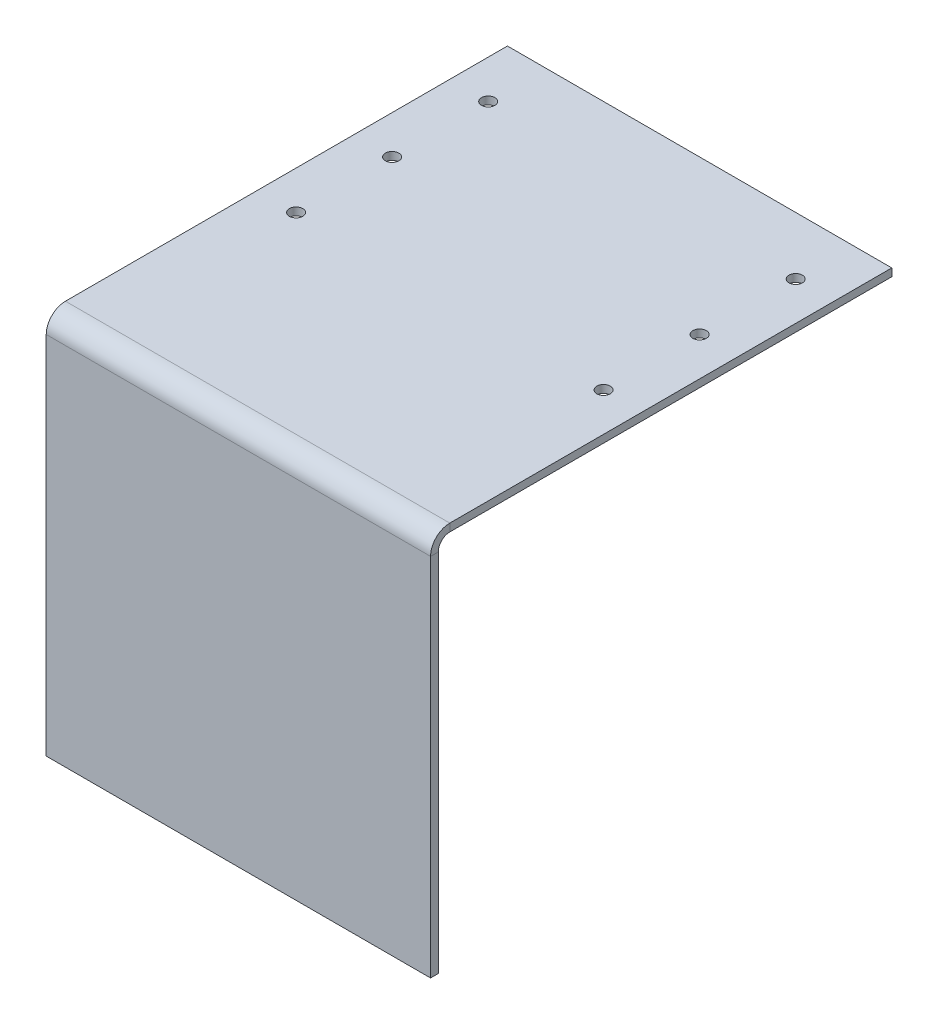
ISO-10303-21;
HEADER;
FILE_DESCRIPTION(('STEP AP214'),'2;1');
FILE_NAME('part.step','',(''),(''),'','','');
FILE_SCHEMA(('AUTOMOTIVE_DESIGN { 1 0 10303 214 1 1 1 1 }'));
ENDSEC;
DATA;
#1=APPLICATION_CONTEXT('core data for automotive mechanical design processes');
#2=APPLICATION_PROTOCOL_DEFINITION('international standard','automotive_design',2000,#1);
#3=PRODUCT_CONTEXT('',#1,'mechanical');
#4=PRODUCT('Part','Part','',(#3));
#5=PRODUCT_RELATED_PRODUCT_CATEGORY('part','',(#4));
#6=PRODUCT_DEFINITION_FORMATION('','',#4);
#7=PRODUCT_DEFINITION_CONTEXT('part definition',#1,'design');
#8=PRODUCT_DEFINITION('design','',#6,#7);
#9=PRODUCT_DEFINITION_SHAPE('','',#8);
#10=(LENGTH_UNIT() NAMED_UNIT(*) SI_UNIT(.MILLI.,.METRE.));
#11=(NAMED_UNIT(*) PLANE_ANGLE_UNIT() SI_UNIT($,.RADIAN.));
#12=(NAMED_UNIT(*) SI_UNIT($,.STERADIAN.) SOLID_ANGLE_UNIT());
#13=UNCERTAINTY_MEASURE_WITH_UNIT(LENGTH_MEASURE(1.E-05),#10,'distance_accuracy_value','');
#14=(GEOMETRIC_REPRESENTATION_CONTEXT(3) GLOBAL_UNCERTAINTY_ASSIGNED_CONTEXT((#13)) GLOBAL_UNIT_ASSIGNED_CONTEXT((#10,
#11,#12)) REPRESENTATION_CONTEXT('',''));
#15=CARTESIAN_POINT('',(0.,0.,0.));
#16=DIRECTION('',(0.,0.,1.));
#17=DIRECTION('',(1.,0.,0.));
#18=AXIS2_PLACEMENT_3D('',#15,#16,#17);
#19=CARTESIAN_POINT('',(-100.,-4.,120.));
#20=DIRECTION('',(-1.,0.,0.));
#21=DIRECTION('',(0.,0.,1.));
#22=AXIS2_PLACEMENT_3D('',#19,#20,#21);
#23=PLANE('',#22);
#24=DIRECTION('',(0.,0.,1.));
#25=VECTOR('',#24,1.);
#26=CARTESIAN_POINT('',(-100.,-4.,120.));
#27=LINE('',#26,#25);
#28=CARTESIAN_POINT('',(-100.,-4.,-120.));
#29=VERTEX_POINT('',#28);
#30=CARTESIAN_POINT('',(-100.,-4.,110.));
#31=VERTEX_POINT('',#30);
#32=EDGE_CURVE('E153',#29,#31,#27,.T.);
#33=ORIENTED_EDGE('',*,*,#32,.T.);
#34=DIRECTION('',(0.,1.,0.));
#35=VECTOR('',#34,1.);
#36=CARTESIAN_POINT('',(-100.,-4.,110.));
#37=LINE('',#36,#35);
#38=CARTESIAN_POINT('',(-100.,0.,110.));
#39=VERTEX_POINT('',#38);
#40=EDGE_CURVE('E134',#31,#39,#37,.T.);
#41=ORIENTED_EDGE('',*,*,#40,.T.);
#42=DIRECTION('',(0.,0.,1.));
#43=VECTOR('',#42,1.);
#44=CARTESIAN_POINT('',(-100.,0.,120.));
#45=LINE('',#44,#43);
#46=CARTESIAN_POINT('',(-100.,0.,-120.));
#47=VERTEX_POINT('',#46);
#48=EDGE_CURVE('E150',#47,#39,#45,.T.);
#49=ORIENTED_EDGE('',*,*,#48,.F.);
#50=DIRECTION('',(0.,1.,0.));
#51=VECTOR('',#50,1.);
#52=CARTESIAN_POINT('',(-100.,-4.,-120.));
#53=LINE('',#52,#51);
#54=EDGE_CURVE('E11',#29,#47,#53,.T.);
#55=ORIENTED_EDGE('',*,*,#54,.F.);
#56=EDGE_LOOP('',(#33,#41,#49,#55));
#57=FACE_BOUND('',#56,.T.);
#58=ADVANCED_FACE('F17',(#57),#23,.T.);
#59=CARTESIAN_POINT('',(0.,-4.,0.));
#60=DIRECTION('',(0.,-1.,0.));
#61=DIRECTION('',(0.,0.,-1.));
#62=AXIS2_PLACEMENT_3D('',#59,#60,#61);
#63=PLANE('',#62);
#64=CARTESIAN_POINT('',(-80.,-4.,-90.));
#65=DIRECTION('',(0.,-1.,0.));
#66=DIRECTION('',(0.,0.,-1.));
#67=AXIS2_PLACEMENT_3D('',#64,#65,#66);
#68=CIRCLE('',#67,3.5);
#69=CARTESIAN_POINT('',(-80.,-4.,-93.5));
#70=VERTEX_POINT('',#69);
#71=EDGE_CURVE('E208',#70,#70,#68,.T.);
#72=ORIENTED_EDGE('',*,*,#71,.F.);
#73=EDGE_LOOP('',(#72));
#74=FACE_BOUND('',#73,.T.);
#75=CARTESIAN_POINT('',(-80.,-4.,-40.));
#76=DIRECTION('',(0.,-1.,0.));
#77=DIRECTION('',(0.,0.,-1.));
#78=AXIS2_PLACEMENT_3D('',#75,#76,#77);
#79=CIRCLE('',#78,3.5);
#80=CARTESIAN_POINT('',(-80.,-4.,-43.5));
#81=VERTEX_POINT('',#80);
#82=EDGE_CURVE('E21',#81,#81,#79,.T.);
#83=ORIENTED_EDGE('',*,*,#82,.F.);
#84=EDGE_LOOP('',(#83));
#85=FACE_BOUND('',#84,.T.);
#86=CARTESIAN_POINT('',(80.,-4.,-90.));
#87=DIRECTION('',(0.,-1.,0.));
#88=DIRECTION('',(0.,0.,-1.));
#89=AXIS2_PLACEMENT_3D('',#86,#87,#88);
#90=CIRCLE('',#89,3.5);
#91=CARTESIAN_POINT('',(80.,-4.,-93.5));
#92=VERTEX_POINT('',#91);
#93=EDGE_CURVE('E199',#92,#92,#90,.T.);
#94=ORIENTED_EDGE('',*,*,#93,.F.);
#95=EDGE_LOOP('',(#94));
#96=FACE_BOUND('',#95,.T.);
#97=CARTESIAN_POINT('',(80.,-4.,-40.));
#98=DIRECTION('',(0.,-1.,0.));
#99=DIRECTION('',(0.,0.,-1.));
#100=AXIS2_PLACEMENT_3D('',#97,#98,#99);
#101=CIRCLE('',#100,3.5);
#102=CARTESIAN_POINT('',(80.,-4.,-43.5));
#103=VERTEX_POINT('',#102);
#104=EDGE_CURVE('E193',#103,#103,#101,.T.);
#105=ORIENTED_EDGE('',*,*,#104,.F.);
#106=EDGE_LOOP('',(#105));
#107=FACE_BOUND('',#106,.T.);
#108=CARTESIAN_POINT('',(-80.,-4.,10.));
#109=DIRECTION('',(0.,-1.,0.));
#110=DIRECTION('',(0.,0.,-1.));
#111=AXIS2_PLACEMENT_3D('',#108,#109,#110);
#112=CIRCLE('',#111,3.5);
#113=CARTESIAN_POINT('',(-80.,-4.,6.5));
#114=VERTEX_POINT('',#113);
#115=EDGE_CURVE('E187',#114,#114,#112,.T.);
#116=ORIENTED_EDGE('',*,*,#115,.F.);
#117=EDGE_LOOP('',(#116));
#118=FACE_BOUND('',#117,.T.);
#119=CARTESIAN_POINT('',(80.,-4.,10.));
#120=DIRECTION('',(0.,-1.,0.));
#121=DIRECTION('',(0.,0.,-1.));
#122=AXIS2_PLACEMENT_3D('',#119,#120,#121);
#123=CIRCLE('',#122,3.5);
#124=CARTESIAN_POINT('',(80.,-4.,6.5));
#125=VERTEX_POINT('',#124);
#126=EDGE_CURVE('E127',#125,#125,#123,.T.);
#127=ORIENTED_EDGE('',*,*,#126,.F.);
#128=EDGE_LOOP('',(#127));
#129=FACE_BOUND('',#128,.T.);
#130=DIRECTION('',(0.,0.,-1.));
#131=VECTOR('',#130,1.);
#132=CARTESIAN_POINT('',(100.,-4.,120.));
#133=LINE('',#132,#131);
#134=CARTESIAN_POINT('',(100.,-4.,110.));
#135=VERTEX_POINT('',#134);
#136=CARTESIAN_POINT('',(100.,-4.,-120.));
#137=VERTEX_POINT('',#136);
#138=EDGE_CURVE('E147',#135,#137,#133,.T.);
#139=ORIENTED_EDGE('',*,*,#138,.F.);
#140=DIRECTION('',(-1.,0.,0.));
#141=VECTOR('',#140,1.);
#142=CARTESIAN_POINT('',(-100.,-4.,110.));
#143=LINE('',#142,#141);
#144=EDGE_CURVE('E34',#31,#135,#143,.F.);
#145=ORIENTED_EDGE('',*,*,#144,.F.);
#146=ORIENTED_EDGE('',*,*,#32,.F.);
#147=DIRECTION('',(-1.,0.,0.));
#148=VECTOR('',#147,1.);
#149=CARTESIAN_POINT('',(-100.,-4.,-120.));
#150=LINE('',#149,#148);
#151=EDGE_CURVE('E149',#137,#29,#150,.T.);
#152=ORIENTED_EDGE('',*,*,#151,.F.);
#153=EDGE_LOOP('',(#139,#145,#146,#152));
#154=FACE_BOUND('',#153,.T.);
#155=ADVANCED_FACE('F219',(#74,#85,#96,#107,#118,#129,#154),#63,.T.);
#156=CARTESIAN_POINT('',(0.,0.,0.));
#157=DIRECTION('',(0.,-1.,0.));
#158=DIRECTION('',(0.,0.,-1.));
#159=AXIS2_PLACEMENT_3D('',#156,#157,#158);
#160=PLANE('',#159);
#161=CARTESIAN_POINT('',(-80.,0.,-90.));
#162=DIRECTION('',(0.,1.,0.));
#163=DIRECTION('',(0.,0.,1.));
#164=AXIS2_PLACEMENT_3D('',#161,#162,#163);
#165=CIRCLE('',#164,3.5);
#166=CARTESIAN_POINT('',(-80.,0.,-86.5));
#167=VERTEX_POINT('',#166);
#168=EDGE_CURVE('E211',#167,#167,#165,.T.);
#169=ORIENTED_EDGE('',*,*,#168,.F.);
#170=EDGE_LOOP('',(#169));
#171=FACE_BOUND('',#170,.T.);
#172=CARTESIAN_POINT('',(-80.,0.,-40.));
#173=DIRECTION('',(0.,1.,0.));
#174=DIRECTION('',(0.,0.,1.));
#175=AXIS2_PLACEMENT_3D('',#172,#173,#174);
#176=CIRCLE('',#175,3.5);
#177=CARTESIAN_POINT('',(-80.,0.,-36.5));
#178=VERTEX_POINT('',#177);
#179=EDGE_CURVE('E205',#178,#178,#176,.T.);
#180=ORIENTED_EDGE('',*,*,#179,.F.);
#181=EDGE_LOOP('',(#180));
#182=FACE_BOUND('',#181,.T.);
#183=CARTESIAN_POINT('',(80.,0.,-90.));
#184=DIRECTION('',(0.,1.,0.));
#185=DIRECTION('',(0.,0.,1.));
#186=AXIS2_PLACEMENT_3D('',#183,#184,#185);
#187=CIRCLE('',#186,3.5);
#188=CARTESIAN_POINT('',(80.,0.,-86.5));
#189=VERTEX_POINT('',#188);
#190=EDGE_CURVE('E202',#189,#189,#187,.T.);
#191=ORIENTED_EDGE('',*,*,#190,.F.);
#192=EDGE_LOOP('',(#191));
#193=FACE_BOUND('',#192,.T.);
#194=CARTESIAN_POINT('',(80.,0.,-40.));
#195=DIRECTION('',(0.,1.,0.));
#196=DIRECTION('',(0.,0.,1.));
#197=AXIS2_PLACEMENT_3D('',#194,#195,#196);
#198=CIRCLE('',#197,3.5);
#199=CARTESIAN_POINT('',(80.,0.,-36.5));
#200=VERTEX_POINT('',#199);
#201=EDGE_CURVE('E196',#200,#200,#198,.T.);
#202=ORIENTED_EDGE('',*,*,#201,.F.);
#203=EDGE_LOOP('',(#202));
#204=FACE_BOUND('',#203,.T.);
#205=CARTESIAN_POINT('',(-80.,0.,10.));
#206=DIRECTION('',(0.,1.,0.));
#207=DIRECTION('',(0.,0.,1.));
#208=AXIS2_PLACEMENT_3D('',#205,#206,#207);
#209=CIRCLE('',#208,3.5);
#210=CARTESIAN_POINT('',(-80.,0.,13.5));
#211=VERTEX_POINT('',#210);
#212=EDGE_CURVE('E190',#211,#211,#209,.T.);
#213=ORIENTED_EDGE('',*,*,#212,.F.);
#214=EDGE_LOOP('',(#213));
#215=FACE_BOUND('',#214,.T.);
#216=CARTESIAN_POINT('',(80.,0.,10.));
#217=DIRECTION('',(0.,1.,0.));
#218=DIRECTION('',(0.,0.,1.));
#219=AXIS2_PLACEMENT_3D('',#216,#217,#218);
#220=CIRCLE('',#219,3.5);
#221=CARTESIAN_POINT('',(80.,0.,13.5));
#222=VERTEX_POINT('',#221);
#223=EDGE_CURVE('E184',#222,#222,#220,.T.);
#224=ORIENTED_EDGE('',*,*,#223,.F.);
#225=EDGE_LOOP('',(#224));
#226=FACE_BOUND('',#225,.T.);
#227=DIRECTION('',(-1.,0.,0.));
#228=VECTOR('',#227,1.);
#229=CARTESIAN_POINT('',(-100.,0.,110.));
#230=LINE('',#229,#228);
#231=CARTESIAN_POINT('',(100.,0.,110.));
#232=VERTEX_POINT('',#231);
#233=EDGE_CURVE('E128',#39,#232,#230,.F.);
#234=ORIENTED_EDGE('',*,*,#233,.T.);
#235=DIRECTION('',(0.,0.,-1.));
#236=VECTOR('',#235,1.);
#237=CARTESIAN_POINT('',(100.,0.,120.));
#238=LINE('',#237,#236);
#239=CARTESIAN_POINT('',(100.,0.,-120.));
#240=VERTEX_POINT('',#239);
#241=EDGE_CURVE('E145',#232,#240,#238,.T.);
#242=ORIENTED_EDGE('',*,*,#241,.T.);
#243=DIRECTION('',(-1.,0.,0.));
#244=VECTOR('',#243,1.);
#245=CARTESIAN_POINT('',(-100.,0.,-120.));
#246=LINE('',#245,#244);
#247=EDGE_CURVE('E156',#240,#47,#246,.T.);
#248=ORIENTED_EDGE('',*,*,#247,.T.);
#249=ORIENTED_EDGE('',*,*,#48,.T.);
#250=EDGE_LOOP('',(#234,#242,#248,#249));
#251=FACE_BOUND('',#250,.T.);
#252=ADVANCED_FACE('F168',(#171,#182,#193,#204,#215,#226,#251),#160,.F.);
#253=CARTESIAN_POINT('',(100.,-4.,120.));
#254=DIRECTION('',(1.,0.,0.));
#255=DIRECTION('',(0.,0.,-1.));
#256=AXIS2_PLACEMENT_3D('',#253,#254,#255);
#257=PLANE('',#256);
#258=DIRECTION('',(0.,1.,0.));
#259=VECTOR('',#258,1.);
#260=CARTESIAN_POINT('',(100.,-4.,110.));
#261=LINE('',#260,#259);
#262=EDGE_CURVE('E42',#135,#232,#261,.T.);
#263=ORIENTED_EDGE('',*,*,#262,.F.);
#264=ORIENTED_EDGE('',*,*,#138,.T.);
#265=DIRECTION('',(0.,1.,0.));
#266=VECTOR('',#265,1.);
#267=CARTESIAN_POINT('',(100.,-4.,-120.));
#268=LINE('',#267,#266);
#269=EDGE_CURVE('E26',#137,#240,#268,.T.);
#270=ORIENTED_EDGE('',*,*,#269,.T.);
#271=ORIENTED_EDGE('',*,*,#241,.F.);
#272=EDGE_LOOP('',(#263,#264,#270,#271));
#273=FACE_BOUND('',#272,.T.);
#274=ADVANCED_FACE('F19',(#273),#257,.T.);
#275=CARTESIAN_POINT('',(-100.,-4.,-120.));
#276=DIRECTION('',(0.,0.,-1.));
#277=DIRECTION('',(-1.,0.,0.));
#278=AXIS2_PLACEMENT_3D('',#275,#276,#277);
#279=PLANE('',#278);
#280=ORIENTED_EDGE('',*,*,#247,.F.);
#281=ORIENTED_EDGE('',*,*,#269,.F.);
#282=ORIENTED_EDGE('',*,*,#151,.T.);
#283=ORIENTED_EDGE('',*,*,#54,.T.);
#284=EDGE_LOOP('',(#280,#281,#282,#283));
#285=FACE_BOUND('',#284,.T.);
#286=ADVANCED_FACE('F165',(#285),#279,.T.);
#287=CARTESIAN_POINT('',(100.,-10.,110.));
#288=DIRECTION('',(1.,0.,0.));
#289=DIRECTION('',(0.,0.,-1.));
#290=AXIS2_PLACEMENT_3D('',#287,#288,#289);
#291=PLANE('',#290);
#292=DIRECTION('',(0.,0.,-1.));
#293=VECTOR('',#292,1.);
#294=CARTESIAN_POINT('',(100.,-10.,120.));
#295=LINE('',#294,#293);
#296=CARTESIAN_POINT('',(100.,-10.,116.));
#297=VERTEX_POINT('',#296);
#298=CARTESIAN_POINT('',(100.,-10.,120.));
#299=VERTEX_POINT('',#298);
#300=EDGE_CURVE('E109',#297,#299,#295,.F.);
#301=ORIENTED_EDGE('',*,*,#300,.F.);
#302=CARTESIAN_POINT('',(100.,-10.,110.));
#303=DIRECTION('',(-1.,0.,0.));
#304=DIRECTION('',(0.,0.,1.));
#305=AXIS2_PLACEMENT_3D('',#302,#303,#304);
#306=CIRCLE('',#305,6.);
#307=EDGE_CURVE('E137',#135,#297,#306,.F.);
#308=ORIENTED_EDGE('',*,*,#307,.F.);
#309=ORIENTED_EDGE('',*,*,#262,.T.);
#310=CARTESIAN_POINT('',(100.,-10.,110.));
#311=DIRECTION('',(-1.,0.,0.));
#312=DIRECTION('',(0.,0.,1.));
#313=AXIS2_PLACEMENT_3D('',#310,#311,#312);
#314=CIRCLE('',#313,10.);
#315=EDGE_CURVE('E130',#232,#299,#314,.F.);
#316=ORIENTED_EDGE('',*,*,#315,.T.);
#317=EDGE_LOOP('',(#301,#308,#309,#316));
#318=FACE_BOUND('',#317,.T.);
#319=ADVANCED_FACE('F259',(#318),#291,.T.);
#320=CARTESIAN_POINT('',(-100.,-10.,110.));
#321=DIRECTION('',(1.,0.,0.));
#322=DIRECTION('',(0.,0.,-1.));
#323=AXIS2_PLACEMENT_3D('',#320,#321,#322);
#324=PLANE('',#323);
#325=CARTESIAN_POINT('',(-100.,-10.,110.));
#326=DIRECTION('',(-1.,0.,0.));
#327=DIRECTION('',(0.,0.,1.));
#328=AXIS2_PLACEMENT_3D('',#325,#326,#327);
#329=CIRCLE('',#328,6.);
#330=CARTESIAN_POINT('',(-100.,-10.,116.));
#331=VERTEX_POINT('',#330);
#332=EDGE_CURVE('E141',#331,#31,#329,.T.);
#333=ORIENTED_EDGE('',*,*,#332,.F.);
#334=DIRECTION('',(0.,0.,-1.));
#335=VECTOR('',#334,1.);
#336=CARTESIAN_POINT('',(-100.,-10.,116.));
#337=LINE('',#336,#335);
#338=CARTESIAN_POINT('',(-100.,-10.,120.));
#339=VERTEX_POINT('',#338);
#340=EDGE_CURVE('E121',#331,#339,#337,.F.);
#341=ORIENTED_EDGE('',*,*,#340,.T.);
#342=CARTESIAN_POINT('',(-100.,-10.,110.));
#343=DIRECTION('',(-1.,0.,0.));
#344=DIRECTION('',(0.,0.,1.));
#345=AXIS2_PLACEMENT_3D('',#342,#343,#344);
#346=CIRCLE('',#345,10.);
#347=EDGE_CURVE('E131',#339,#39,#346,.T.);
#348=ORIENTED_EDGE('',*,*,#347,.T.);
#349=ORIENTED_EDGE('',*,*,#40,.F.);
#350=EDGE_LOOP('',(#333,#341,#348,#349));
#351=FACE_BOUND('',#350,.T.);
#352=ADVANCED_FACE('F176',(#351),#324,.F.);
#353=CARTESIAN_POINT('',(-100.,-10.,110.));
#354=DIRECTION('',(-1.,0.,0.));
#355=DIRECTION('',(0.,0.,1.));
#356=AXIS2_PLACEMENT_3D('',#353,#354,#355);
#357=CYLINDRICAL_SURFACE('',#356,10.);
#358=ORIENTED_EDGE('',*,*,#233,.F.);
#359=ORIENTED_EDGE('',*,*,#347,.F.);
#360=DIRECTION('',(-1.,0.,0.));
#361=VECTOR('',#360,1.);
#362=CARTESIAN_POINT('',(100.,-10.,120.));
#363=LINE('',#362,#361);
#364=EDGE_CURVE('E119',#339,#299,#363,.F.);
#365=ORIENTED_EDGE('',*,*,#364,.T.);
#366=ORIENTED_EDGE('',*,*,#315,.F.);
#367=EDGE_LOOP('',(#358,#359,#365,#366));
#368=FACE_BOUND('',#367,.T.);
#369=ADVANCED_FACE('F172',(#368),#357,.T.);
#370=CARTESIAN_POINT('',(-100.,-10.,110.));
#371=DIRECTION('',(-1.,0.,0.));
#372=DIRECTION('',(0.,0.,1.));
#373=AXIS2_PLACEMENT_3D('',#370,#371,#372);
#374=CYLINDRICAL_SURFACE('',#373,6.);
#375=ORIENTED_EDGE('',*,*,#144,.T.);
#376=ORIENTED_EDGE('',*,*,#307,.T.);
#377=DIRECTION('',(-1.,0.,0.));
#378=VECTOR('',#377,1.);
#379=CARTESIAN_POINT('',(100.,-10.,116.));
#380=LINE('',#379,#378);
#381=EDGE_CURVE('E124',#297,#331,#380,.T.);
#382=ORIENTED_EDGE('',*,*,#381,.T.);
#383=ORIENTED_EDGE('',*,*,#332,.T.);
#384=EDGE_LOOP('',(#375,#376,#382,#383));
#385=FACE_BOUND('',#384,.T.);
#386=ADVANCED_FACE('F385',(#385),#374,.F.);
#387=CARTESIAN_POINT('',(-100.,-200.,120.));
#388=DIRECTION('',(1.,0.,0.));
#389=DIRECTION('',(0.,1.,0.));
#390=AXIS2_PLACEMENT_3D('',#387,#388,#389);
#391=PLANE('',#390);
#392=ORIENTED_EDGE('',*,*,#340,.F.);
#393=DIRECTION('',(0.,1.,0.));
#394=VECTOR('',#393,1.);
#395=CARTESIAN_POINT('',(-100.,-200.,116.));
#396=LINE('',#395,#394);
#397=CARTESIAN_POINT('',(-100.,-200.,116.));
#398=VERTEX_POINT('',#397);
#399=EDGE_CURVE('E117',#331,#398,#396,.F.);
#400=ORIENTED_EDGE('',*,*,#399,.T.);
#401=DIRECTION('',(0.,0.,-1.));
#402=VECTOR('',#401,1.);
#403=CARTESIAN_POINT('',(-100.,-200.,120.));
#404=LINE('',#403,#402);
#405=CARTESIAN_POINT('',(-100.,-200.,120.));
#406=VERTEX_POINT('',#405);
#407=EDGE_CURVE('E105',#406,#398,#404,.T.);
#408=ORIENTED_EDGE('',*,*,#407,.F.);
#409=DIRECTION('',(0.,-1.,0.));
#410=VECTOR('',#409,1.);
#411=CARTESIAN_POINT('',(-100.,4.16138551622649E-13,120.));
#412=LINE('',#411,#410);
#413=EDGE_CURVE('E92',#339,#406,#412,.T.);
#414=ORIENTED_EDGE('',*,*,#413,.F.);
#415=EDGE_LOOP('',(#392,#400,#408,#414));
#416=FACE_BOUND('',#415,.T.);
#417=ADVANCED_FACE('F180',(#416),#391,.F.);
#418=CARTESIAN_POINT('',(100.,-4.,120.));
#419=DIRECTION('',(-1.,0.,0.));
#420=DIRECTION('',(0.,-1.,0.));
#421=AXIS2_PLACEMENT_3D('',#418,#419,#420);
#422=PLANE('',#421);
#423=ORIENTED_EDGE('',*,*,#300,.T.);
#424=DIRECTION('',(0.,1.,0.));
#425=VECTOR('',#424,1.);
#426=CARTESIAN_POINT('',(100.,4.44460567556963E-13,120.));
#427=LINE('',#426,#425);
#428=CARTESIAN_POINT('',(100.,-200.,120.));
#429=VERTEX_POINT('',#428);
#430=EDGE_CURVE('E90',#429,#299,#427,.T.);
#431=ORIENTED_EDGE('',*,*,#430,.F.);
#432=DIRECTION('',(0.,0.,-1.));
#433=VECTOR('',#432,1.);
#434=CARTESIAN_POINT('',(100.,-200.,120.));
#435=LINE('',#434,#433);
#436=CARTESIAN_POINT('',(100.,-200.,116.));
#437=VERTEX_POINT('',#436);
#438=EDGE_CURVE('E98',#429,#437,#435,.T.);
#439=ORIENTED_EDGE('',*,*,#438,.T.);
#440=DIRECTION('',(0.,-1.,0.));
#441=VECTOR('',#440,1.);
#442=CARTESIAN_POINT('',(100.,-4.,116.));
#443=LINE('',#442,#441);
#444=EDGE_CURVE('E114',#437,#297,#443,.F.);
#445=ORIENTED_EDGE('',*,*,#444,.T.);
#446=EDGE_LOOP('',(#423,#431,#439,#445));
#447=FACE_BOUND('',#446,.T.);
#448=ADVANCED_FACE('F108',(#447),#422,.F.);
#449=CARTESIAN_POINT('',(0.,4.30299559589806E-13,120.));
#450=DIRECTION('',(0.,0.,-1.));
#451=DIRECTION('',(0.,1.,0.));
#452=AXIS2_PLACEMENT_3D('',#449,#450,#451);
#453=PLANE('',#452);
#454=ORIENTED_EDGE('',*,*,#364,.F.);
#455=ORIENTED_EDGE('',*,*,#413,.T.);
#456=DIRECTION('',(1.,0.,0.));
#457=VECTOR('',#456,1.);
#458=CARTESIAN_POINT('',(0.,-200.,120.));
#459=LINE('',#458,#457);
#460=EDGE_CURVE('E85',#406,#429,#459,.T.);
#461=ORIENTED_EDGE('',*,*,#460,.T.);
#462=ORIENTED_EDGE('',*,*,#430,.T.);
#463=EDGE_LOOP('',(#454,#455,#461,#462));
#464=FACE_BOUND('',#463,.T.);
#465=ADVANCED_FACE('F88',(#464),#453,.F.);
#466=CARTESIAN_POINT('',(0.,4.16333634234434E-13,116.));
#467=DIRECTION('',(0.,0.,-1.));
#468=DIRECTION('',(0.,1.,0.));
#469=AXIS2_PLACEMENT_3D('',#466,#467,#468);
#470=PLANE('',#469);
#471=ORIENTED_EDGE('',*,*,#399,.F.);
#472=ORIENTED_EDGE('',*,*,#381,.F.);
#473=ORIENTED_EDGE('',*,*,#444,.F.);
#474=DIRECTION('',(-1.,0.,0.));
#475=VECTOR('',#474,1.);
#476=CARTESIAN_POINT('',(100.,-200.,116.));
#477=LINE('',#476,#475);
#478=EDGE_CURVE('E101',#398,#437,#477,.F.);
#479=ORIENTED_EDGE('',*,*,#478,.F.);
#480=EDGE_LOOP('',(#471,#472,#473,#479));
#481=FACE_BOUND('',#480,.T.);
#482=ADVANCED_FACE('F245',(#481),#470,.T.);
#483=CARTESIAN_POINT('',(100.,-200.,120.));
#484=DIRECTION('',(0.,1.,0.));
#485=DIRECTION('',(0.,0.,1.));
#486=AXIS2_PLACEMENT_3D('',#483,#484,#485);
#487=PLANE('',#486);
#488=ORIENTED_EDGE('',*,*,#478,.T.);
#489=ORIENTED_EDGE('',*,*,#438,.F.);
#490=ORIENTED_EDGE('',*,*,#460,.F.);
#491=ORIENTED_EDGE('',*,*,#407,.T.);
#492=EDGE_LOOP('',(#488,#489,#490,#491));
#493=FACE_BOUND('',#492,.T.);
#494=ADVANCED_FACE('F99',(#493),#487,.F.);
#495=CARTESIAN_POINT('',(80.,0.,10.));
#496=DIRECTION('',(0.,1.,0.));
#497=DIRECTION('',(0.,0.,1.));
#498=AXIS2_PLACEMENT_3D('',#495,#496,#497);
#499=CYLINDRICAL_SURFACE('',#498,3.5);
#500=ORIENTED_EDGE('',*,*,#126,.T.);
#501=EDGE_LOOP('',(#500));
#502=FACE_BOUND('',#501,.T.);
#503=ORIENTED_EDGE('',*,*,#223,.T.);
#504=EDGE_LOOP('',(#503));
#505=FACE_BOUND('',#504,.T.);
#506=ADVANCED_FACE('F231',(#502,#505),#499,.F.);
#507=CARTESIAN_POINT('',(-80.,0.,10.));
#508=DIRECTION('',(0.,1.,0.));
#509=DIRECTION('',(0.,0.,1.));
#510=AXIS2_PLACEMENT_3D('',#507,#508,#509);
#511=CYLINDRICAL_SURFACE('',#510,3.5);
#512=ORIENTED_EDGE('',*,*,#115,.T.);
#513=EDGE_LOOP('',(#512));
#514=FACE_BOUND('',#513,.T.);
#515=ORIENTED_EDGE('',*,*,#212,.T.);
#516=EDGE_LOOP('',(#515));
#517=FACE_BOUND('',#516,.T.);
#518=ADVANCED_FACE('F233',(#514,#517),#511,.F.);
#519=CARTESIAN_POINT('',(80.,0.,-40.));
#520=DIRECTION('',(0.,1.,0.));
#521=DIRECTION('',(0.,0.,1.));
#522=AXIS2_PLACEMENT_3D('',#519,#520,#521);
#523=CYLINDRICAL_SURFACE('',#522,3.5);
#524=ORIENTED_EDGE('',*,*,#104,.T.);
#525=EDGE_LOOP('',(#524));
#526=FACE_BOUND('',#525,.T.);
#527=ORIENTED_EDGE('',*,*,#201,.T.);
#528=EDGE_LOOP('',(#527));
#529=FACE_BOUND('',#528,.T.);
#530=ADVANCED_FACE('F241',(#526,#529),#523,.F.);
#531=CARTESIAN_POINT('',(80.,0.,-90.));
#532=DIRECTION('',(0.,1.,0.));
#533=DIRECTION('',(0.,0.,1.));
#534=AXIS2_PLACEMENT_3D('',#531,#532,#533);
#535=CYLINDRICAL_SURFACE('',#534,3.5);
#536=ORIENTED_EDGE('',*,*,#93,.T.);
#537=EDGE_LOOP('',(#536));
#538=FACE_BOUND('',#537,.T.);
#539=ORIENTED_EDGE('',*,*,#190,.T.);
#540=EDGE_LOOP('',(#539));
#541=FACE_BOUND('',#540,.T.);
#542=ADVANCED_FACE('F323',(#538,#541),#535,.F.);
#543=CARTESIAN_POINT('',(-80.,0.,-40.));
#544=DIRECTION('',(0.,1.,0.));
#545=DIRECTION('',(0.,0.,1.));
#546=AXIS2_PLACEMENT_3D('',#543,#544,#545);
#547=CYLINDRICAL_SURFACE('',#546,3.5);
#548=ORIENTED_EDGE('',*,*,#82,.T.);
#549=EDGE_LOOP('',(#548));
#550=FACE_BOUND('',#549,.T.);
#551=ORIENTED_EDGE('',*,*,#179,.T.);
#552=EDGE_LOOP('',(#551));
#553=FACE_BOUND('',#552,.T.);
#554=ADVANCED_FACE('F334',(#550,#553),#547,.F.);
#555=CARTESIAN_POINT('',(-80.,0.,-90.));
#556=DIRECTION('',(0.,1.,0.));
#557=DIRECTION('',(0.,0.,1.));
#558=AXIS2_PLACEMENT_3D('',#555,#556,#557);
#559=CYLINDRICAL_SURFACE('',#558,3.5);
#560=ORIENTED_EDGE('',*,*,#71,.T.);
#561=EDGE_LOOP('',(#560));
#562=FACE_BOUND('',#561,.T.);
#563=ORIENTED_EDGE('',*,*,#168,.T.);
#564=EDGE_LOOP('',(#563));
#565=FACE_BOUND('',#564,.T.);
#566=ADVANCED_FACE('F215',(#562,#565),#559,.F.);
#567=CLOSED_SHELL('',(#58,#155,#252,#274,#286,#319,#352,#369,#386,#417,#448,#465,#482,#494,#506,
#518,#530,#542,#554,#566));
#568=MANIFOLD_SOLID_BREP('B1',#567);
#569=ADVANCED_BREP_SHAPE_REPRESENTATION('',(#18,#568),#14);
#570=SHAPE_DEFINITION_REPRESENTATION(#9,#569);
ENDSEC;
END-ISO-10303-21;
